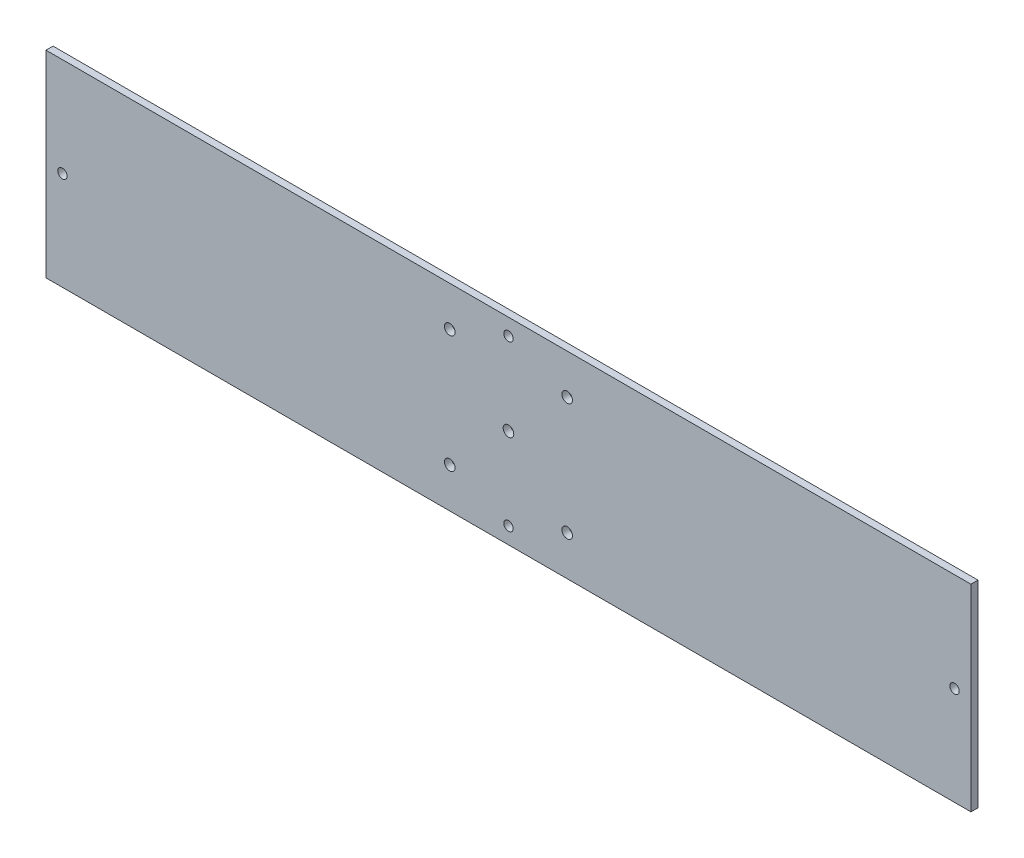
ISO-10303-21;
HEADER;
FILE_DESCRIPTION(('STEP AP214'),'2;1');
FILE_NAME('part.step','',(''),(''),'','','');
FILE_SCHEMA(('AUTOMOTIVE_DESIGN { 1 0 10303 214 1 1 1 1 }'));
ENDSEC;
DATA;
#1=APPLICATION_CONTEXT('core data for automotive mechanical design processes');
#2=APPLICATION_PROTOCOL_DEFINITION('international standard','automotive_design',2000,#1);
#3=PRODUCT_CONTEXT('',#1,'mechanical');
#4=PRODUCT('Part','Part','',(#3));
#5=PRODUCT_RELATED_PRODUCT_CATEGORY('part','',(#4));
#6=PRODUCT_DEFINITION_FORMATION('','',#4);
#7=PRODUCT_DEFINITION_CONTEXT('part definition',#1,'design');
#8=PRODUCT_DEFINITION('design','',#6,#7);
#9=PRODUCT_DEFINITION_SHAPE('','',#8);
#10=(LENGTH_UNIT() NAMED_UNIT(*) SI_UNIT(.MILLI.,.METRE.));
#11=(NAMED_UNIT(*) PLANE_ANGLE_UNIT() SI_UNIT($,.RADIAN.));
#12=(NAMED_UNIT(*) SI_UNIT($,.STERADIAN.) SOLID_ANGLE_UNIT());
#13=UNCERTAINTY_MEASURE_WITH_UNIT(LENGTH_MEASURE(1.E-05),#10,'distance_accuracy_value','');
#14=(GEOMETRIC_REPRESENTATION_CONTEXT(3) GLOBAL_UNCERTAINTY_ASSIGNED_CONTEXT((#13)) GLOBAL_UNIT_ASSIGNED_CONTEXT((#10,
#11,#12)) REPRESENTATION_CONTEXT('',''));
#15=CARTESIAN_POINT('',(0.,0.,0.));
#16=DIRECTION('',(0.,0.,1.));
#17=DIRECTION('',(1.,0.,0.));
#18=AXIS2_PLACEMENT_3D('',#15,#16,#17);
#19=CARTESIAN_POINT('',(0.,0.,3.));
#20=DIRECTION('',(0.,0.,-1.));
#21=DIRECTION('',(-1.,0.,0.));
#22=AXIS2_PLACEMENT_3D('',#19,#20,#21);
#23=PLANE('',#22);
#24=CARTESIAN_POINT('',(222.,17.,3.));
#25=DIRECTION('',(0.,0.,1.));
#26=DIRECTION('',(1.,0.,0.));
#27=AXIS2_PLACEMENT_3D('',#24,#25,#26);
#28=CIRCLE('',#27,2.25000000000001);
#29=CARTESIAN_POINT('',(224.25,17.,3.));
#30=VERTEX_POINT('',#29);
#31=EDGE_CURVE('E153',#30,#30,#28,.T.);
#32=ORIENTED_EDGE('',*,*,#31,.F.);
#33=EDGE_LOOP('',(#32));
#34=FACE_BOUND('',#33,.T.);
#35=CARTESIAN_POINT('',(172.,67.,3.));
#36=DIRECTION('',(0.,0.,1.));
#37=DIRECTION('',(1.,0.,0.));
#38=AXIS2_PLACEMENT_3D('',#35,#36,#37);
#39=CIRCLE('',#38,2.25000000000001);
#40=CARTESIAN_POINT('',(174.25,67.,3.));
#41=VERTEX_POINT('',#40);
#42=EDGE_CURVE('E141',#41,#41,#39,.T.);
#43=ORIENTED_EDGE('',*,*,#42,.F.);
#44=EDGE_LOOP('',(#43));
#45=FACE_BOUND('',#44,.T.);
#46=CARTESIAN_POINT('',(387.,42.,3.));
#47=DIRECTION('',(0.,0.,1.));
#48=DIRECTION('',(1.,0.,0.));
#49=AXIS2_PLACEMENT_3D('',#46,#47,#48);
#50=CIRCLE('',#49,2.);
#51=CARTESIAN_POINT('',(389.,42.,3.));
#52=VERTEX_POINT('',#51);
#53=EDGE_CURVE('E129',#52,#52,#50,.T.);
#54=ORIENTED_EDGE('',*,*,#53,.F.);
#55=EDGE_LOOP('',(#54));
#56=FACE_BOUND('',#55,.T.);
#57=CARTESIAN_POINT('',(197.,77.,3.));
#58=DIRECTION('',(0.,0.,1.));
#59=DIRECTION('',(1.,0.,0.));
#60=AXIS2_PLACEMENT_3D('',#57,#58,#59);
#61=CIRCLE('',#60,2.);
#62=CARTESIAN_POINT('',(199.,77.,3.));
#63=VERTEX_POINT('',#62);
#64=EDGE_CURVE('E117',#63,#63,#61,.T.);
#65=ORIENTED_EDGE('',*,*,#64,.F.);
#66=EDGE_LOOP('',(#65));
#67=FACE_BOUND('',#66,.T.);
#68=DIRECTION('',(1.,0.,0.));
#69=VECTOR('',#68,1.);
#70=CARTESIAN_POINT('',(394.,0.,3.));
#71=LINE('',#70,#69);
#72=CARTESIAN_POINT('',(0.,0.,3.));
#73=VERTEX_POINT('',#72);
#74=CARTESIAN_POINT('',(394.,0.,3.));
#75=VERTEX_POINT('',#74);
#76=EDGE_CURVE('E87',#73,#75,#71,.T.);
#77=ORIENTED_EDGE('',*,*,#76,.T.);
#78=DIRECTION('',(0.,1.,0.));
#79=VECTOR('',#78,1.);
#80=CARTESIAN_POINT('',(394.,84.,3.));
#81=LINE('',#80,#79);
#82=CARTESIAN_POINT('',(394.,84.,3.));
#83=VERTEX_POINT('',#82);
#84=EDGE_CURVE('E82',#75,#83,#81,.T.);
#85=ORIENTED_EDGE('',*,*,#84,.T.);
#86=DIRECTION('',(-1.,0.,0.));
#87=VECTOR('',#86,1.);
#88=CARTESIAN_POINT('',(0.,84.,3.));
#89=LINE('',#88,#87);
#90=CARTESIAN_POINT('',(0.,84.,3.));
#91=VERTEX_POINT('',#90);
#92=EDGE_CURVE('E85',#83,#91,#89,.T.);
#93=ORIENTED_EDGE('',*,*,#92,.T.);
#94=DIRECTION('',(0.,-1.,0.));
#95=VECTOR('',#94,1.);
#96=CARTESIAN_POINT('',(0.,0.,3.));
#97=LINE('',#96,#95);
#98=EDGE_CURVE('E52',#91,#73,#97,.T.);
#99=ORIENTED_EDGE('',*,*,#98,.T.);
#100=EDGE_LOOP('',(#77,#85,#93,#99));
#101=FACE_BOUND('',#100,.T.);
#102=CARTESIAN_POINT('',(7.,42.,3.));
#103=DIRECTION('',(0.,0.,1.));
#104=DIRECTION('',(1.,0.,0.));
#105=AXIS2_PLACEMENT_3D('',#102,#103,#104);
#106=CIRCLE('',#105,2.);
#107=CARTESIAN_POINT('',(9.,42.,3.));
#108=VERTEX_POINT('',#107);
#109=EDGE_CURVE('E102',#108,#108,#106,.T.);
#110=ORIENTED_EDGE('',*,*,#109,.F.);
#111=EDGE_LOOP('',(#110));
#112=FACE_BOUND('',#111,.T.);
#113=CARTESIAN_POINT('',(197.,7.00000000000001,3.));
#114=DIRECTION('',(0.,0.,1.));
#115=DIRECTION('',(1.,0.,0.));
#116=AXIS2_PLACEMENT_3D('',#113,#114,#115);
#117=CIRCLE('',#116,2.);
#118=CARTESIAN_POINT('',(199.,7.00000000000001,3.));
#119=VERTEX_POINT('',#118);
#120=EDGE_CURVE('E123',#119,#119,#117,.T.);
#121=ORIENTED_EDGE('',*,*,#120,.F.);
#122=EDGE_LOOP('',(#121));
#123=FACE_BOUND('',#122,.T.);
#124=CARTESIAN_POINT('',(197.,42.,3.));
#125=DIRECTION('',(0.,0.,1.));
#126=DIRECTION('',(1.,0.,0.));
#127=AXIS2_PLACEMENT_3D('',#124,#125,#126);
#128=CIRCLE('',#127,2.25000000000001);
#129=CARTESIAN_POINT('',(199.25,42.,3.));
#130=VERTEX_POINT('',#129);
#131=EDGE_CURVE('E135',#130,#130,#128,.T.);
#132=ORIENTED_EDGE('',*,*,#131,.F.);
#133=EDGE_LOOP('',(#132));
#134=FACE_BOUND('',#133,.T.);
#135=CARTESIAN_POINT('',(172.,17.,3.));
#136=DIRECTION('',(0.,0.,1.));
#137=DIRECTION('',(1.,0.,0.));
#138=AXIS2_PLACEMENT_3D('',#135,#136,#137);
#139=CIRCLE('',#138,2.25000000000001);
#140=CARTESIAN_POINT('',(174.25,17.,3.));
#141=VERTEX_POINT('',#140);
#142=EDGE_CURVE('E147',#141,#141,#139,.T.);
#143=ORIENTED_EDGE('',*,*,#142,.F.);
#144=EDGE_LOOP('',(#143));
#145=FACE_BOUND('',#144,.T.);
#146=CARTESIAN_POINT('',(222.,67.,3.));
#147=DIRECTION('',(0.,0.,1.));
#148=DIRECTION('',(1.,0.,0.));
#149=AXIS2_PLACEMENT_3D('',#146,#147,#148);
#150=CIRCLE('',#149,2.25000000000001);
#151=CARTESIAN_POINT('',(224.25,67.,3.));
#152=VERTEX_POINT('',#151);
#153=EDGE_CURVE('E159',#152,#152,#150,.T.);
#154=ORIENTED_EDGE('',*,*,#153,.F.);
#155=EDGE_LOOP('',(#154));
#156=FACE_BOUND('',#155,.T.);
#157=ADVANCED_FACE('F35',(#34,#45,#56,#67,#101,#112,#123,#134,#145,#156),#23,.F.);
#158=CARTESIAN_POINT('',(0.,0.,0.));
#159=DIRECTION('',(0.,0.,-1.));
#160=DIRECTION('',(-1.,0.,0.));
#161=AXIS2_PLACEMENT_3D('',#158,#159,#160);
#162=PLANE('',#161);
#163=CARTESIAN_POINT('',(222.,17.,0.));
#164=DIRECTION('',(0.,0.,1.));
#165=DIRECTION('',(1.,0.,0.));
#166=AXIS2_PLACEMENT_3D('',#163,#164,#165);
#167=CIRCLE('',#166,2.25000000000001);
#168=CARTESIAN_POINT('',(224.25,17.,0.));
#169=VERTEX_POINT('',#168);
#170=EDGE_CURVE('E156',#169,#169,#167,.T.);
#171=ORIENTED_EDGE('',*,*,#170,.T.);
#172=EDGE_LOOP('',(#171));
#173=FACE_BOUND('',#172,.T.);
#174=CARTESIAN_POINT('',(172.,67.,0.));
#175=DIRECTION('',(0.,0.,1.));
#176=DIRECTION('',(1.,0.,0.));
#177=AXIS2_PLACEMENT_3D('',#174,#175,#176);
#178=CIRCLE('',#177,2.25000000000001);
#179=CARTESIAN_POINT('',(174.25,67.,0.));
#180=VERTEX_POINT('',#179);
#181=EDGE_CURVE('E144',#180,#180,#178,.T.);
#182=ORIENTED_EDGE('',*,*,#181,.T.);
#183=EDGE_LOOP('',(#182));
#184=FACE_BOUND('',#183,.T.);
#185=CARTESIAN_POINT('',(387.,42.,0.));
#186=DIRECTION('',(0.,0.,1.));
#187=DIRECTION('',(1.,0.,0.));
#188=AXIS2_PLACEMENT_3D('',#185,#186,#187);
#189=CIRCLE('',#188,2.);
#190=CARTESIAN_POINT('',(389.,42.,0.));
#191=VERTEX_POINT('',#190);
#192=EDGE_CURVE('E132',#191,#191,#189,.T.);
#193=ORIENTED_EDGE('',*,*,#192,.T.);
#194=EDGE_LOOP('',(#193));
#195=FACE_BOUND('',#194,.T.);
#196=CARTESIAN_POINT('',(197.,77.,0.));
#197=DIRECTION('',(0.,0.,1.));
#198=DIRECTION('',(1.,0.,0.));
#199=AXIS2_PLACEMENT_3D('',#196,#197,#198);
#200=CIRCLE('',#199,2.);
#201=CARTESIAN_POINT('',(199.,77.,0.));
#202=VERTEX_POINT('',#201);
#203=EDGE_CURVE('E120',#202,#202,#200,.T.);
#204=ORIENTED_EDGE('',*,*,#203,.T.);
#205=EDGE_LOOP('',(#204));
#206=FACE_BOUND('',#205,.T.);
#207=DIRECTION('',(1.,0.,0.));
#208=VECTOR('',#207,1.);
#209=CARTESIAN_POINT('',(394.,0.,0.));
#210=LINE('',#209,#208);
#211=CARTESIAN_POINT('',(0.,0.,0.));
#212=VERTEX_POINT('',#211);
#213=CARTESIAN_POINT('',(394.,0.,0.));
#214=VERTEX_POINT('',#213);
#215=EDGE_CURVE('E99',#212,#214,#210,.T.);
#216=ORIENTED_EDGE('',*,*,#215,.F.);
#217=DIRECTION('',(0.,-1.,0.));
#218=VECTOR('',#217,1.);
#219=CARTESIAN_POINT('',(0.,0.,0.));
#220=LINE('',#219,#218);
#221=CARTESIAN_POINT('',(0.,84.,0.));
#222=VERTEX_POINT('',#221);
#223=EDGE_CURVE('E75',#222,#212,#220,.T.);
#224=ORIENTED_EDGE('',*,*,#223,.F.);
#225=DIRECTION('',(-1.,0.,0.));
#226=VECTOR('',#225,1.);
#227=CARTESIAN_POINT('',(0.,84.,0.));
#228=LINE('',#227,#226);
#229=CARTESIAN_POINT('',(394.,84.,0.));
#230=VERTEX_POINT('',#229);
#231=EDGE_CURVE('E69',#230,#222,#228,.T.);
#232=ORIENTED_EDGE('',*,*,#231,.F.);
#233=DIRECTION('',(0.,1.,0.));
#234=VECTOR('',#233,1.);
#235=CARTESIAN_POINT('',(394.,84.,0.));
#236=LINE('',#235,#234);
#237=EDGE_CURVE('E91',#214,#230,#236,.T.);
#238=ORIENTED_EDGE('',*,*,#237,.F.);
#239=EDGE_LOOP('',(#216,#224,#232,#238));
#240=FACE_BOUND('',#239,.T.);
#241=CARTESIAN_POINT('',(7.,42.,0.));
#242=DIRECTION('',(0.,0.,1.));
#243=DIRECTION('',(1.,0.,0.));
#244=AXIS2_PLACEMENT_3D('',#241,#242,#243);
#245=CIRCLE('',#244,2.);
#246=CARTESIAN_POINT('',(9.,42.,0.));
#247=VERTEX_POINT('',#246);
#248=EDGE_CURVE('E114',#247,#247,#245,.T.);
#249=ORIENTED_EDGE('',*,*,#248,.T.);
#250=EDGE_LOOP('',(#249));
#251=FACE_BOUND('',#250,.T.);
#252=CARTESIAN_POINT('',(197.,7.00000000000001,0.));
#253=DIRECTION('',(0.,0.,1.));
#254=DIRECTION('',(1.,0.,0.));
#255=AXIS2_PLACEMENT_3D('',#252,#253,#254);
#256=CIRCLE('',#255,2.);
#257=CARTESIAN_POINT('',(199.,7.00000000000001,0.));
#258=VERTEX_POINT('',#257);
#259=EDGE_CURVE('E126',#258,#258,#256,.T.);
#260=ORIENTED_EDGE('',*,*,#259,.T.);
#261=EDGE_LOOP('',(#260));
#262=FACE_BOUND('',#261,.T.);
#263=CARTESIAN_POINT('',(197.,42.,0.));
#264=DIRECTION('',(0.,0.,1.));
#265=DIRECTION('',(1.,0.,0.));
#266=AXIS2_PLACEMENT_3D('',#263,#264,#265);
#267=CIRCLE('',#266,2.25000000000001);
#268=CARTESIAN_POINT('',(199.25,42.,0.));
#269=VERTEX_POINT('',#268);
#270=EDGE_CURVE('E138',#269,#269,#267,.T.);
#271=ORIENTED_EDGE('',*,*,#270,.T.);
#272=EDGE_LOOP('',(#271));
#273=FACE_BOUND('',#272,.T.);
#274=CARTESIAN_POINT('',(172.,17.,0.));
#275=DIRECTION('',(0.,0.,1.));
#276=DIRECTION('',(1.,0.,0.));
#277=AXIS2_PLACEMENT_3D('',#274,#275,#276);
#278=CIRCLE('',#277,2.25000000000001);
#279=CARTESIAN_POINT('',(174.25,17.,0.));
#280=VERTEX_POINT('',#279);
#281=EDGE_CURVE('E150',#280,#280,#278,.T.);
#282=ORIENTED_EDGE('',*,*,#281,.T.);
#283=EDGE_LOOP('',(#282));
#284=FACE_BOUND('',#283,.T.);
#285=CARTESIAN_POINT('',(222.,67.,0.));
#286=DIRECTION('',(0.,0.,1.));
#287=DIRECTION('',(1.,0.,0.));
#288=AXIS2_PLACEMENT_3D('',#285,#286,#287);
#289=CIRCLE('',#288,2.25000000000001);
#290=CARTESIAN_POINT('',(224.25,67.,0.));
#291=VERTEX_POINT('',#290);
#292=EDGE_CURVE('E162',#291,#291,#289,.T.);
#293=ORIENTED_EDGE('',*,*,#292,.T.);
#294=EDGE_LOOP('',(#293));
#295=FACE_BOUND('',#294,.T.);
#296=ADVANCED_FACE('F110',(#173,#184,#195,#206,#240,#251,#262,#273,#284,#295),#162,.T.);
#297=CARTESIAN_POINT('',(394.,0.,3.));
#298=DIRECTION('',(0.,1.,0.));
#299=DIRECTION('',(-1.,0.,0.));
#300=AXIS2_PLACEMENT_3D('',#297,#298,#299);
#301=PLANE('',#300);
#302=ORIENTED_EDGE('',*,*,#215,.T.);
#303=DIRECTION('',(0.,0.,-1.));
#304=VECTOR('',#303,1.);
#305=CARTESIAN_POINT('',(394.,0.,3.));
#306=LINE('',#305,#304);
#307=EDGE_CURVE('E11',#75,#214,#306,.T.);
#308=ORIENTED_EDGE('',*,*,#307,.F.);
#309=ORIENTED_EDGE('',*,*,#76,.F.);
#310=DIRECTION('',(0.,0.,-1.));
#311=VECTOR('',#310,1.);
#312=CARTESIAN_POINT('',(0.,0.,3.));
#313=LINE('',#312,#311);
#314=EDGE_CURVE('E95',#73,#212,#313,.T.);
#315=ORIENTED_EDGE('',*,*,#314,.T.);
#316=EDGE_LOOP('',(#302,#308,#309,#315));
#317=FACE_BOUND('',#316,.T.);
#318=ADVANCED_FACE('F37',(#317),#301,.F.);
#319=CARTESIAN_POINT('',(394.,84.,3.));
#320=DIRECTION('',(-1.,0.,0.));
#321=DIRECTION('',(0.,0.,1.));
#322=AXIS2_PLACEMENT_3D('',#319,#320,#321);
#323=PLANE('',#322);
#324=ORIENTED_EDGE('',*,*,#237,.T.);
#325=DIRECTION('',(0.,0.,-1.));
#326=VECTOR('',#325,1.);
#327=CARTESIAN_POINT('',(394.,84.,3.));
#328=LINE('',#327,#326);
#329=EDGE_CURVE('E44',#83,#230,#328,.T.);
#330=ORIENTED_EDGE('',*,*,#329,.F.);
#331=ORIENTED_EDGE('',*,*,#84,.F.);
#332=ORIENTED_EDGE('',*,*,#307,.T.);
#333=EDGE_LOOP('',(#324,#330,#331,#332));
#334=FACE_BOUND('',#333,.T.);
#335=ADVANCED_FACE('F90',(#334),#323,.F.);
#336=CARTESIAN_POINT('',(0.,84.,3.));
#337=DIRECTION('',(0.,-1.,0.));
#338=DIRECTION('',(0.,0.,-1.));
#339=AXIS2_PLACEMENT_3D('',#336,#337,#338);
#340=PLANE('',#339);
#341=ORIENTED_EDGE('',*,*,#231,.T.);
#342=DIRECTION('',(0.,0.,-1.));
#343=VECTOR('',#342,1.);
#344=CARTESIAN_POINT('',(0.,84.,3.));
#345=LINE('',#344,#343);
#346=EDGE_CURVE('E92',#91,#222,#345,.T.);
#347=ORIENTED_EDGE('',*,*,#346,.F.);
#348=ORIENTED_EDGE('',*,*,#92,.F.);
#349=ORIENTED_EDGE('',*,*,#329,.T.);
#350=EDGE_LOOP('',(#341,#347,#348,#349));
#351=FACE_BOUND('',#350,.T.);
#352=ADVANCED_FACE('F93',(#351),#340,.F.);
#353=CARTESIAN_POINT('',(0.,0.,3.));
#354=DIRECTION('',(1.,0.,0.));
#355=DIRECTION('',(0.,0.,-1.));
#356=AXIS2_PLACEMENT_3D('',#353,#354,#355);
#357=PLANE('',#356);
#358=ORIENTED_EDGE('',*,*,#223,.T.);
#359=ORIENTED_EDGE('',*,*,#314,.F.);
#360=ORIENTED_EDGE('',*,*,#98,.F.);
#361=ORIENTED_EDGE('',*,*,#346,.T.);
#362=EDGE_LOOP('',(#358,#359,#360,#361));
#363=FACE_BOUND('',#362,.T.);
#364=ADVANCED_FACE('F107',(#363),#357,.F.);
#365=CARTESIAN_POINT('',(7.,42.,3.));
#366=DIRECTION('',(0.,0.,-1.));
#367=DIRECTION('',(-1.,0.,0.));
#368=AXIS2_PLACEMENT_3D('',#365,#366,#367);
#369=CYLINDRICAL_SURFACE('',#368,2.);
#370=ORIENTED_EDGE('',*,*,#109,.T.);
#371=EDGE_LOOP('',(#370));
#372=FACE_BOUND('',#371,.T.);
#373=ORIENTED_EDGE('',*,*,#248,.F.);
#374=EDGE_LOOP('',(#373));
#375=FACE_BOUND('',#374,.T.);
#376=ADVANCED_FACE('F182',(#372,#375),#369,.F.);
#377=CARTESIAN_POINT('',(197.,77.,3.));
#378=DIRECTION('',(0.,0.,-1.));
#379=DIRECTION('',(-1.,0.,0.));
#380=AXIS2_PLACEMENT_3D('',#377,#378,#379);
#381=CYLINDRICAL_SURFACE('',#380,2.);
#382=ORIENTED_EDGE('',*,*,#64,.T.);
#383=EDGE_LOOP('',(#382));
#384=FACE_BOUND('',#383,.T.);
#385=ORIENTED_EDGE('',*,*,#203,.F.);
#386=EDGE_LOOP('',(#385));
#387=FACE_BOUND('',#386,.T.);
#388=ADVANCED_FACE('F230',(#384,#387),#381,.F.);
#389=CARTESIAN_POINT('',(197.,7.00000000000001,3.));
#390=DIRECTION('',(0.,0.,-1.));
#391=DIRECTION('',(-1.,0.,0.));
#392=AXIS2_PLACEMENT_3D('',#389,#390,#391);
#393=CYLINDRICAL_SURFACE('',#392,2.);
#394=ORIENTED_EDGE('',*,*,#120,.T.);
#395=EDGE_LOOP('',(#394));
#396=FACE_BOUND('',#395,.T.);
#397=ORIENTED_EDGE('',*,*,#259,.F.);
#398=EDGE_LOOP('',(#397));
#399=FACE_BOUND('',#398,.T.);
#400=ADVANCED_FACE('F238',(#396,#399),#393,.F.);
#401=CARTESIAN_POINT('',(387.,42.,3.));
#402=DIRECTION('',(0.,0.,-1.));
#403=DIRECTION('',(-1.,0.,0.));
#404=AXIS2_PLACEMENT_3D('',#401,#402,#403);
#405=CYLINDRICAL_SURFACE('',#404,2.);
#406=ORIENTED_EDGE('',*,*,#53,.T.);
#407=EDGE_LOOP('',(#406));
#408=FACE_BOUND('',#407,.T.);
#409=ORIENTED_EDGE('',*,*,#192,.F.);
#410=EDGE_LOOP('',(#409));
#411=FACE_BOUND('',#410,.T.);
#412=ADVANCED_FACE('F246',(#408,#411),#405,.F.);
#413=CARTESIAN_POINT('',(197.,42.,3.));
#414=DIRECTION('',(0.,0.,-1.));
#415=DIRECTION('',(-1.,0.,0.));
#416=AXIS2_PLACEMENT_3D('',#413,#414,#415);
#417=CYLINDRICAL_SURFACE('',#416,2.25000000000001);
#418=ORIENTED_EDGE('',*,*,#131,.T.);
#419=EDGE_LOOP('',(#418));
#420=FACE_BOUND('',#419,.T.);
#421=ORIENTED_EDGE('',*,*,#270,.F.);
#422=EDGE_LOOP('',(#421));
#423=FACE_BOUND('',#422,.T.);
#424=ADVANCED_FACE('F255',(#420,#423),#417,.F.);
#425=CARTESIAN_POINT('',(172.,67.,3.));
#426=DIRECTION('',(0.,0.,-1.));
#427=DIRECTION('',(-1.,0.,0.));
#428=AXIS2_PLACEMENT_3D('',#425,#426,#427);
#429=CYLINDRICAL_SURFACE('',#428,2.25000000000001);
#430=ORIENTED_EDGE('',*,*,#42,.T.);
#431=EDGE_LOOP('',(#430));
#432=FACE_BOUND('',#431,.T.);
#433=ORIENTED_EDGE('',*,*,#181,.F.);
#434=EDGE_LOOP('',(#433));
#435=FACE_BOUND('',#434,.T.);
#436=ADVANCED_FACE('F264',(#432,#435),#429,.F.);
#437=CARTESIAN_POINT('',(172.,17.,3.));
#438=DIRECTION('',(0.,0.,-1.));
#439=DIRECTION('',(-1.,0.,0.));
#440=AXIS2_PLACEMENT_3D('',#437,#438,#439);
#441=CYLINDRICAL_SURFACE('',#440,2.25000000000001);
#442=ORIENTED_EDGE('',*,*,#142,.T.);
#443=EDGE_LOOP('',(#442));
#444=FACE_BOUND('',#443,.T.);
#445=ORIENTED_EDGE('',*,*,#281,.F.);
#446=EDGE_LOOP('',(#445));
#447=FACE_BOUND('',#446,.T.);
#448=ADVANCED_FACE('F273',(#444,#447),#441,.F.);
#449=CARTESIAN_POINT('',(222.,17.,3.));
#450=DIRECTION('',(0.,0.,-1.));
#451=DIRECTION('',(-1.,0.,0.));
#452=AXIS2_PLACEMENT_3D('',#449,#450,#451);
#453=CYLINDRICAL_SURFACE('',#452,2.25000000000001);
#454=ORIENTED_EDGE('',*,*,#31,.T.);
#455=EDGE_LOOP('',(#454));
#456=FACE_BOUND('',#455,.T.);
#457=ORIENTED_EDGE('',*,*,#170,.F.);
#458=EDGE_LOOP('',(#457));
#459=FACE_BOUND('',#458,.T.);
#460=ADVANCED_FACE('F282',(#456,#459),#453,.F.);
#461=CARTESIAN_POINT('',(222.,67.,3.));
#462=DIRECTION('',(0.,0.,-1.));
#463=DIRECTION('',(-1.,0.,0.));
#464=AXIS2_PLACEMENT_3D('',#461,#462,#463);
#465=CYLINDRICAL_SURFACE('',#464,2.25000000000001);
#466=ORIENTED_EDGE('',*,*,#153,.T.);
#467=EDGE_LOOP('',(#466));
#468=FACE_BOUND('',#467,.T.);
#469=ORIENTED_EDGE('',*,*,#292,.F.);
#470=EDGE_LOOP('',(#469));
#471=FACE_BOUND('',#470,.T.);
#472=ADVANCED_FACE('F168',(#468,#471),#465,.F.);
#473=CLOSED_SHELL('',(#157,#296,#318,#335,#352,#364,#376,#388,#400,#412,#424,#436,#448,#460,#472));
#474=MANIFOLD_SOLID_BREP('B2',#473);
#475=ADVANCED_BREP_SHAPE_REPRESENTATION('',(#18,#474),#14);
#476=SHAPE_DEFINITION_REPRESENTATION(#9,#475);
ENDSEC;
END-ISO-10303-21;
